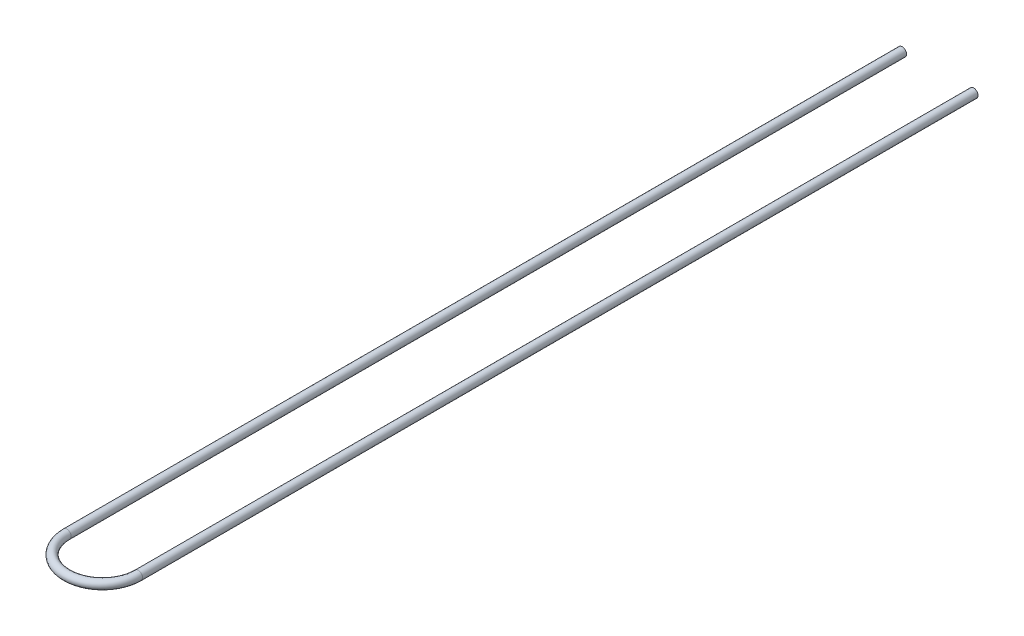
ISO-10303-21;
HEADER;
FILE_DESCRIPTION(('STEP AP214'),'2;1');
FILE_NAME('part.step','',(''),(''),'','','');
FILE_SCHEMA(('AUTOMOTIVE_DESIGN { 1 0 10303 214 1 1 1 1 }'));
ENDSEC;
DATA;
#1=APPLICATION_CONTEXT('core data for automotive mechanical design processes');
#2=APPLICATION_PROTOCOL_DEFINITION('international standard','automotive_design',2000,#1);
#3=PRODUCT_CONTEXT('',#1,'mechanical');
#4=PRODUCT('Part','Part','',(#3));
#5=PRODUCT_RELATED_PRODUCT_CATEGORY('part','',(#4));
#6=PRODUCT_DEFINITION_FORMATION('','',#4);
#7=PRODUCT_DEFINITION_CONTEXT('part definition',#1,'design');
#8=PRODUCT_DEFINITION('design','',#6,#7);
#9=PRODUCT_DEFINITION_SHAPE('','',#8);
#10=(LENGTH_UNIT() NAMED_UNIT(*) SI_UNIT(.MILLI.,.METRE.));
#11=(NAMED_UNIT(*) PLANE_ANGLE_UNIT() SI_UNIT($,.RADIAN.));
#12=(NAMED_UNIT(*) SI_UNIT($,.STERADIAN.) SOLID_ANGLE_UNIT());
#13=UNCERTAINTY_MEASURE_WITH_UNIT(LENGTH_MEASURE(1.E-05),#10,'distance_accuracy_value','');
#14=(GEOMETRIC_REPRESENTATION_CONTEXT(3) GLOBAL_UNCERTAINTY_ASSIGNED_CONTEXT((#13)) GLOBAL_UNIT_ASSIGNED_CONTEXT((#10,
#11,#12)) REPRESENTATION_CONTEXT('',''));
#15=CARTESIAN_POINT('',(0.,0.,0.));
#16=DIRECTION('',(0.,0.,1.));
#17=DIRECTION('',(1.,0.,0.));
#18=AXIS2_PLACEMENT_3D('',#15,#16,#17);
#19=CARTESIAN_POINT('',(-40.,0.,299.999999999999));
#20=DIRECTION('',(0.,0.,1.));
#21=DIRECTION('',(1.,0.,0.));
#22=AXIS2_PLACEMENT_3D('',#19,#20,#21);
#23=CYLINDRICAL_SURFACE('',#22,11.1);
#24=CARTESIAN_POINT('',(-39.9999999999997,0.,2440.));
#25=DIRECTION('',(0.,0.,1.));
#26=DIRECTION('',(1.,0.,0.));
#27=AXIS2_PLACEMENT_3D('',#24,#25,#26);
#28=CIRCLE('',#27,11.1);
#29=CARTESIAN_POINT('',(-51.0999999999997,0.,2440.));
#30=VERTEX_POINT('',#29);
#31=EDGE_CURVE('E54',#30,#30,#28,.T.);
#32=ORIENTED_EDGE('',*,*,#31,.F.);
#33=EDGE_LOOP('',(#32));
#34=FACE_BOUND('',#33,.T.);
#35=CARTESIAN_POINT('',(-40.,0.,299.999999999999));
#36=DIRECTION('',(0.,0.,1.));
#37=DIRECTION('',(1.,0.,0.));
#38=AXIS2_PLACEMENT_3D('',#35,#36,#37);
#39=CIRCLE('',#38,11.1);
#40=CARTESIAN_POINT('',(-28.9,0.,299.999999999999));
#41=VERTEX_POINT('',#40);
#42=EDGE_CURVE('E52',#41,#41,#39,.T.);
#43=ORIENTED_EDGE('',*,*,#42,.T.);
#44=EDGE_LOOP('',(#43));
#45=FACE_BOUND('',#44,.T.);
#46=ADVANCED_FACE('F31',(#34,#45),#23,.T.);
#47=CARTESIAN_POINT('',(51.5400000000003,0.,2440.));
#48=DIRECTION('',(0.,1.,0.));
#49=DIRECTION('',(0.,0.,1.));
#50=AXIS2_PLACEMENT_3D('',#47,#48,#49);
#51=TOROIDAL_SURFACE('',#50,91.54,11.1);
#52=CARTESIAN_POINT('',(143.08,0.,2440.));
#53=DIRECTION('',(0.,0.,-1.));
#54=DIRECTION('',(-1.,0.,0.));
#55=AXIS2_PLACEMENT_3D('',#52,#53,#54);
#56=CIRCLE('',#55,11.1);
#57=CARTESIAN_POINT('',(154.18,0.,2440.));
#58=VERTEX_POINT('',#57);
#59=EDGE_CURVE('E35',#58,#58,#56,.T.);
#60=CARTESIAN_POINT('',(51.5400000000003,0.,2440.));
#61=DIRECTION('',(0.,1.,0.));
#62=DIRECTION('',(0.,0.,1.));
#63=AXIS2_PLACEMENT_3D('',#60,#61,#62);
#64=CIRCLE('',#63,102.64);
#65=EDGE_CURVE('',#30,#58,#64,.T.);
#66=ORIENTED_EDGE('',*,*,#31,.T.);
#67=ORIENTED_EDGE('',*,*,#59,.F.);
#68=ORIENTED_EDGE('',*,*,#65,.T.);
#69=ORIENTED_EDGE('',*,*,#65,.F.);
#70=EDGE_LOOP('',(#66,#68,#67,#69));
#71=FACE_BOUND('',#70,.T.);
#72=ADVANCED_FACE('F62',(#71),#51,.T.);
#73=CARTESIAN_POINT('',(143.08,0.,2440.));
#74=DIRECTION('',(0.,0.,-1.));
#75=DIRECTION('',(-1.,0.,0.));
#76=AXIS2_PLACEMENT_3D('',#73,#74,#75);
#77=CYLINDRICAL_SURFACE('',#76,11.1);
#78=CARTESIAN_POINT('',(143.08,0.,299.999999999999));
#79=DIRECTION('',(0.,0.,-1.));
#80=DIRECTION('',(-1.,0.,0.));
#81=AXIS2_PLACEMENT_3D('',#78,#79,#80);
#82=CIRCLE('',#81,11.1);
#83=CARTESIAN_POINT('',(131.98,0.,299.999999999999));
#84=VERTEX_POINT('',#83);
#85=EDGE_CURVE('E48',#84,#84,#82,.T.);
#86=ORIENTED_EDGE('',*,*,#85,.F.);
#87=EDGE_LOOP('',(#86));
#88=FACE_BOUND('',#87,.T.);
#89=ORIENTED_EDGE('',*,*,#59,.T.);
#90=EDGE_LOOP('',(#89));
#91=FACE_BOUND('',#90,.T.);
#92=ADVANCED_FACE('F33',(#88,#91),#77,.T.);
#93=CARTESIAN_POINT('',(-40.,0.,299.999999999999));
#94=DIRECTION('',(0.,0.,1.));
#95=DIRECTION('',(1.,0.,0.));
#96=AXIS2_PLACEMENT_3D('',#93,#94,#95);
#97=PLANE('',#96);
#98=CARTESIAN_POINT('',(-40.,0.,299.999999999999));
#99=DIRECTION('',(0.,0.,1.));
#100=DIRECTION('',(1.,0.,0.));
#101=AXIS2_PLACEMENT_3D('',#98,#99,#100);
#102=CIRCLE('',#101,9.95000000000001);
#103=CARTESIAN_POINT('',(-30.05,0.,299.999999999999));
#104=VERTEX_POINT('',#103);
#105=EDGE_CURVE('E51',#104,#104,#102,.F.);
#106=ORIENTED_EDGE('',*,*,#105,.F.);
#107=EDGE_LOOP('',(#106));
#108=FACE_BOUND('',#107,.T.);
#109=ORIENTED_EDGE('',*,*,#42,.F.);
#110=EDGE_LOOP('',(#109));
#111=FACE_BOUND('',#110,.T.);
#112=ADVANCED_FACE('F68',(#108,#111),#97,.F.);
#113=CARTESIAN_POINT('',(143.08,0.,299.999999999999));
#114=DIRECTION('',(0.,0.,-1.));
#115=DIRECTION('',(-1.,0.,0.));
#116=AXIS2_PLACEMENT_3D('',#113,#114,#115);
#117=PLANE('',#116);
#118=CARTESIAN_POINT('',(143.08,0.,299.999999999999));
#119=DIRECTION('',(0.,0.,-1.));
#120=DIRECTION('',(-1.,0.,0.));
#121=AXIS2_PLACEMENT_3D('',#118,#119,#120);
#122=CIRCLE('',#121,9.95000000000001);
#123=CARTESIAN_POINT('',(133.13,0.,299.999999999999));
#124=VERTEX_POINT('',#123);
#125=EDGE_CURVE('E10',#124,#124,#122,.F.);
#126=ORIENTED_EDGE('',*,*,#125,.T.);
#127=EDGE_LOOP('',(#126));
#128=FACE_BOUND('',#127,.T.);
#129=ORIENTED_EDGE('',*,*,#85,.T.);
#130=EDGE_LOOP('',(#129));
#131=FACE_BOUND('',#130,.T.);
#132=ADVANCED_FACE('F86',(#128,#131),#117,.T.);
#133=CARTESIAN_POINT('',(-40.,0.,299.999999999999));
#134=DIRECTION('',(0.,0.,1.));
#135=DIRECTION('',(1.,0.,0.));
#136=AXIS2_PLACEMENT_3D('',#133,#134,#135);
#137=CYLINDRICAL_SURFACE('',#136,9.95000000000001);
#138=CARTESIAN_POINT('',(-39.9999999999997,0.,2440.));
#139=DIRECTION('',(0.,0.,1.));
#140=DIRECTION('',(1.,0.,0.));
#141=AXIS2_PLACEMENT_3D('',#138,#139,#140);
#142=CIRCLE('',#141,9.95000000000001);
#143=CARTESIAN_POINT('',(-49.9499999999997,0.,2440.));
#144=VERTEX_POINT('',#143);
#145=EDGE_CURVE('E44',#144,#144,#142,.F.);
#146=ORIENTED_EDGE('',*,*,#145,.F.);
#147=EDGE_LOOP('',(#146));
#148=FACE_BOUND('',#147,.T.);
#149=ORIENTED_EDGE('',*,*,#105,.T.);
#150=EDGE_LOOP('',(#149));
#151=FACE_BOUND('',#150,.T.);
#152=ADVANCED_FACE('F80',(#148,#151),#137,.F.);
#153=CARTESIAN_POINT('',(51.5400000000003,0.,2440.));
#154=DIRECTION('',(0.,1.,0.));
#155=DIRECTION('',(0.,0.,1.));
#156=AXIS2_PLACEMENT_3D('',#153,#154,#155);
#157=TOROIDAL_SURFACE('',#156,91.54,9.95000000000001);
#158=CARTESIAN_POINT('',(143.08,0.,2440.));
#159=DIRECTION('',(0.,0.,-1.));
#160=DIRECTION('',(-1.,0.,0.));
#161=AXIS2_PLACEMENT_3D('',#158,#159,#160);
#162=CIRCLE('',#161,9.95000000000001);
#163=CARTESIAN_POINT('',(153.03,0.,2440.));
#164=VERTEX_POINT('',#163);
#165=EDGE_CURVE('E39',#164,#164,#162,.F.);
#166=CARTESIAN_POINT('',(51.5400000000003,0.,2440.));
#167=DIRECTION('',(0.,1.,0.));
#168=DIRECTION('',(0.,0.,1.));
#169=AXIS2_PLACEMENT_3D('',#166,#167,#168);
#170=CIRCLE('',#169,101.49);
#171=EDGE_CURVE('',#144,#164,#170,.T.);
#172=ORIENTED_EDGE('',*,*,#145,.T.);
#173=ORIENTED_EDGE('',*,*,#165,.F.);
#174=ORIENTED_EDGE('',*,*,#171,.T.);
#175=ORIENTED_EDGE('',*,*,#171,.F.);
#176=EDGE_LOOP('',(#172,#174,#173,#175));
#177=FACE_BOUND('',#176,.T.);
#178=ADVANCED_FACE('F74',(#177),#157,.F.);
#179=CARTESIAN_POINT('',(143.08,0.,2440.));
#180=DIRECTION('',(0.,0.,-1.));
#181=DIRECTION('',(-1.,0.,0.));
#182=AXIS2_PLACEMENT_3D('',#179,#180,#181);
#183=CYLINDRICAL_SURFACE('',#182,9.95000000000001);
#184=ORIENTED_EDGE('',*,*,#125,.F.);
#185=EDGE_LOOP('',(#184));
#186=FACE_BOUND('',#185,.T.);
#187=ORIENTED_EDGE('',*,*,#165,.T.);
#188=EDGE_LOOP('',(#187));
#189=FACE_BOUND('',#188,.T.);
#190=ADVANCED_FACE('F72',(#186,#189),#183,.F.);
#191=CLOSED_SHELL('',(#46,#72,#92,#112,#132,#152,#178,#190));
#192=MANIFOLD_SOLID_BREP('B2',#191);
#193=ADVANCED_BREP_SHAPE_REPRESENTATION('',(#18,#192),#14);
#194=SHAPE_DEFINITION_REPRESENTATION(#9,#193);
ENDSEC;
END-ISO-10303-21;
